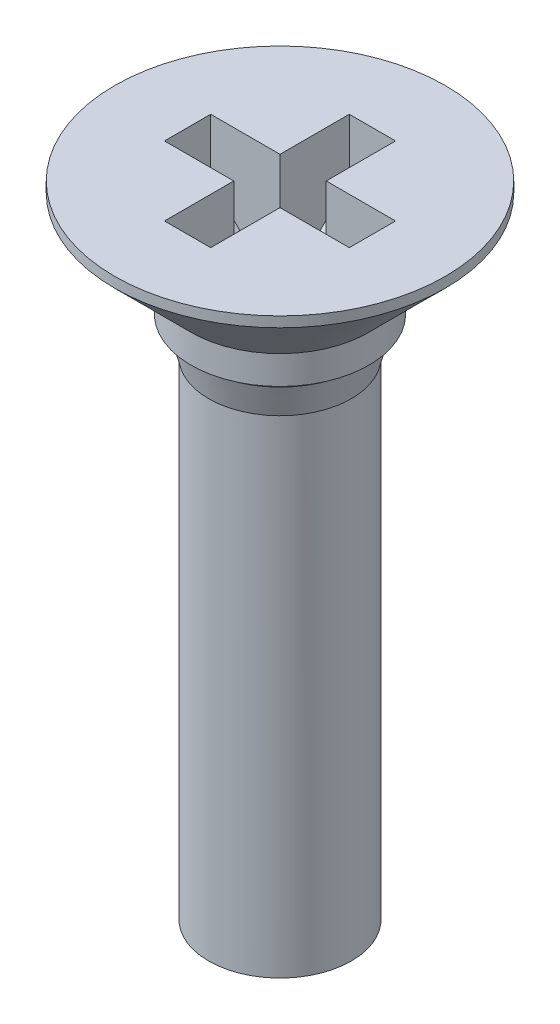
ISO-10303-21;
HEADER;
FILE_DESCRIPTION(('STEP AP214'),'2;1');
FILE_NAME('part.step','',(''),(''),'','','');
FILE_SCHEMA(('AUTOMOTIVE_DESIGN { 1 0 10303 214 1 1 1 1 }'));
ENDSEC;
DATA;
#1=APPLICATION_CONTEXT('core data for automotive mechanical design processes');
#2=APPLICATION_PROTOCOL_DEFINITION('international standard','automotive_design',2000,#1);
#3=PRODUCT_CONTEXT('',#1,'mechanical');
#4=PRODUCT('Part','Part','',(#3));
#5=PRODUCT_RELATED_PRODUCT_CATEGORY('part','',(#4));
#6=PRODUCT_DEFINITION_FORMATION('','',#4);
#7=PRODUCT_DEFINITION_CONTEXT('part definition',#1,'design');
#8=PRODUCT_DEFINITION('design','',#6,#7);
#9=PRODUCT_DEFINITION_SHAPE('','',#8);
#10=(LENGTH_UNIT() NAMED_UNIT(*) SI_UNIT(.MILLI.,.METRE.));
#11=(NAMED_UNIT(*) PLANE_ANGLE_UNIT() SI_UNIT($,.RADIAN.));
#12=(NAMED_UNIT(*) SI_UNIT($,.STERADIAN.) SOLID_ANGLE_UNIT());
#13=UNCERTAINTY_MEASURE_WITH_UNIT(LENGTH_MEASURE(1.E-05),#10,'distance_accuracy_value','');
#14=(GEOMETRIC_REPRESENTATION_CONTEXT(3) GLOBAL_UNCERTAINTY_ASSIGNED_CONTEXT((#13)) GLOBAL_UNIT_ASSIGNED_CONTEXT((#10,
#11,#12)) REPRESENTATION_CONTEXT('',''));
#15=CARTESIAN_POINT('',(0.,0.,0.));
#16=DIRECTION('',(0.,0.,1.));
#17=DIRECTION('',(1.,0.,0.));
#18=AXIS2_PLACEMENT_3D('',#15,#16,#17);
#19=CARTESIAN_POINT('',(0.,-4.2,-0.65));
#20=DIRECTION('',(0.,0.,-1.));
#21=DIRECTION('',(-1.,0.,0.));
#22=AXIS2_PLACEMENT_3D('',#19,#20,#21);
#23=PLANE('',#22);
#24=DIRECTION('',(0.,1.,0.));
#25=VECTOR('',#24,1.);
#26=CARTESIAN_POINT('',(0.65,-4.2,-0.65));
#27=LINE('',#26,#25);
#28=CARTESIAN_POINT('',(0.65,-3.2,-0.65));
#29=VERTEX_POINT('',#28);
#30=CARTESIAN_POINT('',(0.65,0.,-0.65));
#31=VERTEX_POINT('',#30);
#32=EDGE_CURVE('E202',#29,#31,#27,.T.);
#33=ORIENTED_EDGE('',*,*,#32,.F.);
#34=DIRECTION('',(1.,0.,0.));
#35=VECTOR('',#34,1.);
#36=CARTESIAN_POINT('',(-1.,-3.2,-0.65));
#37=LINE('',#36,#35);
#38=CARTESIAN_POINT('',(1.,-3.2,-0.65));
#39=VERTEX_POINT('',#38);
#40=EDGE_CURVE('E237',#29,#39,#37,.T.);
#41=ORIENTED_EDGE('',*,*,#40,.T.);
#42=DIRECTION('',(0.707106781186547,0.707106781186548,0.));
#43=VECTOR('',#42,1.);
#44=CARTESIAN_POINT('',(2.6,-1.6,-0.65));
#45=LINE('',#44,#43);
#46=CARTESIAN_POINT('',(2.6,-1.6,-0.65));
#47=VERTEX_POINT('',#46);
#48=EDGE_CURVE('E241',#39,#47,#45,.T.);
#49=ORIENTED_EDGE('',*,*,#48,.T.);
#50=DIRECTION('',(0.,1.,0.));
#51=VECTOR('',#50,1.);
#52=CARTESIAN_POINT('',(2.6,0.,-0.65));
#53=LINE('',#52,#51);
#54=CARTESIAN_POINT('',(2.6,0.,-0.65));
#55=VERTEX_POINT('',#54);
#56=EDGE_CURVE('E244',#47,#55,#53,.T.);
#57=ORIENTED_EDGE('',*,*,#56,.T.);
#58=DIRECTION('',(-1.,0.,0.));
#59=VECTOR('',#58,1.);
#60=CARTESIAN_POINT('',(2.6,0.,-0.65));
#61=LINE('',#60,#59);
#62=EDGE_CURVE('E248',#55,#31,#61,.T.);
#63=ORIENTED_EDGE('',*,*,#62,.T.);
#64=EDGE_LOOP('',(#33,#41,#49,#57,#63));
#65=FACE_BOUND('',#64,.T.);
#66=ADVANCED_FACE('F37',(#65),#23,.F.);
#67=CARTESIAN_POINT('',(0.,-4.2,0.65));
#68=DIRECTION('',(0.,0.,-1.));
#69=DIRECTION('',(-1.,0.,0.));
#70=AXIS2_PLACEMENT_3D('',#67,#68,#69);
#71=PLANE('',#70);
#72=DIRECTION('',(1.,0.,0.));
#73=VECTOR('',#72,1.);
#74=CARTESIAN_POINT('',(-1.,-3.2,0.65));
#75=LINE('',#74,#73);
#76=CARTESIAN_POINT('',(0.65,-3.2,0.65));
#77=VERTEX_POINT('',#76);
#78=CARTESIAN_POINT('',(1.,-3.2,0.65));
#79=VERTEX_POINT('',#78);
#80=EDGE_CURVE('E219',#77,#79,#75,.T.);
#81=ORIENTED_EDGE('',*,*,#80,.F.);
#82=DIRECTION('',(0.,1.,0.));
#83=VECTOR('',#82,1.);
#84=CARTESIAN_POINT('',(0.65,-4.2,0.65));
#85=LINE('',#84,#83);
#86=CARTESIAN_POINT('',(0.65,0.,0.65));
#87=VERTEX_POINT('',#86);
#88=EDGE_CURVE('E45',#77,#87,#85,.T.);
#89=ORIENTED_EDGE('',*,*,#88,.T.);
#90=DIRECTION('',(-1.,0.,0.));
#91=VECTOR('',#90,1.);
#92=CARTESIAN_POINT('',(2.6,0.,0.65));
#93=LINE('',#92,#91);
#94=CARTESIAN_POINT('',(2.6,0.,0.65));
#95=VERTEX_POINT('',#94);
#96=EDGE_CURVE('E228',#95,#87,#93,.T.);
#97=ORIENTED_EDGE('',*,*,#96,.F.);
#98=DIRECTION('',(0.,1.,0.));
#99=VECTOR('',#98,1.);
#100=CARTESIAN_POINT('',(2.6,0.,0.65));
#101=LINE('',#100,#99);
#102=CARTESIAN_POINT('',(2.6,-1.6,0.65));
#103=VERTEX_POINT('',#102);
#104=EDGE_CURVE('E225',#103,#95,#101,.T.);
#105=ORIENTED_EDGE('',*,*,#104,.F.);
#106=DIRECTION('',(0.707106781186547,0.707106781186548,0.));
#107=VECTOR('',#106,1.);
#108=CARTESIAN_POINT('',(2.6,-1.6,0.65));
#109=LINE('',#108,#107);
#110=EDGE_CURVE('E222',#79,#103,#109,.T.);
#111=ORIENTED_EDGE('',*,*,#110,.F.);
#112=EDGE_LOOP('',(#81,#89,#97,#105,#111));
#113=FACE_BOUND('',#112,.T.);
#114=ADVANCED_FACE('F291',(#113),#71,.T.);
#115=CARTESIAN_POINT('',(0.,0.,0.));
#116=DIRECTION('',(0.,-1.,0.));
#117=DIRECTION('',(1.,0.,0.));
#118=AXIS2_PLACEMENT_3D('',#115,#116,#117);
#119=PLANE('',#118);
#120=DIRECTION('',(1.,0.,0.));
#121=VECTOR('',#120,1.);
#122=CARTESIAN_POINT('',(-0.65,0.,2.6));
#123=LINE('',#122,#121);
#124=CARTESIAN_POINT('',(-0.65,0.,2.6));
#125=VERTEX_POINT('',#124);
#126=CARTESIAN_POINT('',(0.65,0.,2.6));
#127=VERTEX_POINT('',#126);
#128=EDGE_CURVE('E203',#125,#127,#123,.T.);
#129=ORIENTED_EDGE('',*,*,#128,.F.);
#130=DIRECTION('',(0.,0.,1.));
#131=VECTOR('',#130,1.);
#132=CARTESIAN_POINT('',(-0.65,0.,-2.6));
#133=LINE('',#132,#131);
#134=CARTESIAN_POINT('',(-0.65,0.,0.65));
#135=VERTEX_POINT('',#134);
#136=EDGE_CURVE('E196',#135,#125,#133,.T.);
#137=ORIENTED_EDGE('',*,*,#136,.F.);
#138=CARTESIAN_POINT('',(-2.6,0.,0.65));
#139=VERTEX_POINT('',#138);
#140=EDGE_CURVE('E227',#135,#139,#93,.T.);
#141=ORIENTED_EDGE('',*,*,#140,.T.);
#142=DIRECTION('',(0.,0.,1.));
#143=VECTOR('',#142,1.);
#144=CARTESIAN_POINT('',(-2.6,0.,-0.65));
#145=LINE('',#144,#143);
#146=CARTESIAN_POINT('',(-2.6,0.,-0.65));
#147=VERTEX_POINT('',#146);
#148=EDGE_CURVE('E258',#147,#139,#145,.T.);
#149=ORIENTED_EDGE('',*,*,#148,.F.);
#150=CARTESIAN_POINT('',(-0.65,0.,-0.65));
#151=VERTEX_POINT('',#150);
#152=EDGE_CURVE('E247',#151,#147,#61,.T.);
#153=ORIENTED_EDGE('',*,*,#152,.F.);
#154=CARTESIAN_POINT('',(-0.65,0.,-2.6));
#155=VERTEX_POINT('',#154);
#156=EDGE_CURVE('E197',#155,#151,#133,.T.);
#157=ORIENTED_EDGE('',*,*,#156,.F.);
#158=DIRECTION('',(1.,0.,0.));
#159=VECTOR('',#158,1.);
#160=CARTESIAN_POINT('',(-0.65,0.,-2.6));
#161=LINE('',#160,#159);
#162=CARTESIAN_POINT('',(0.65,0.,-2.6));
#163=VERTEX_POINT('',#162);
#164=EDGE_CURVE('E205',#155,#163,#161,.T.);
#165=ORIENTED_EDGE('',*,*,#164,.T.);
#166=DIRECTION('',(0.,0.,1.));
#167=VECTOR('',#166,1.);
#168=CARTESIAN_POINT('',(0.65,0.,-2.6));
#169=LINE('',#168,#167);
#170=EDGE_CURVE('E181',#163,#31,#169,.T.);
#171=ORIENTED_EDGE('',*,*,#170,.T.);
#172=ORIENTED_EDGE('',*,*,#62,.F.);
#173=DIRECTION('',(0.,0.,1.));
#174=VECTOR('',#173,1.);
#175=CARTESIAN_POINT('',(2.6,0.,-0.65));
#176=LINE('',#175,#174);
#177=EDGE_CURVE('E261',#55,#95,#176,.T.);
#178=ORIENTED_EDGE('',*,*,#177,.T.);
#179=ORIENTED_EDGE('',*,*,#96,.T.);
#180=EDGE_CURVE('E60',#87,#127,#169,.T.);
#181=ORIENTED_EDGE('',*,*,#180,.T.);
#182=EDGE_LOOP('',(#129,#137,#141,#149,#153,#157,#165,#171,#172,#178,#179,#181));
#183=FACE_BOUND('',#182,.T.);
#184=CARTESIAN_POINT('',(0.,0.,0.));
#185=DIRECTION('',(0.,1.,0.));
#186=DIRECTION('',(-1.,0.,0.));
#187=AXIS2_PLACEMENT_3D('',#184,#185,#186);
#188=CIRCLE('',#187,4.65);
#189=CARTESIAN_POINT('',(-4.65,0.,0.));
#190=VERTEX_POINT('',#189);
#191=EDGE_CURVE('E287',#190,#190,#188,.T.);
#192=ORIENTED_EDGE('',*,*,#191,.T.);
#193=EDGE_LOOP('',(#192));
#194=FACE_BOUND('',#193,.T.);
#195=ADVANCED_FACE('F39',(#183,#194),#119,.F.);
#196=CARTESIAN_POINT('',(0.,0.,0.));
#197=DIRECTION('',(0.,1.,0.));
#198=DIRECTION('',(-1.,0.,0.));
#199=AXIS2_PLACEMENT_3D('',#196,#197,#198);
#200=CYLINDRICAL_SURFACE('',#199,4.65);
#201=ORIENTED_EDGE('',*,*,#191,.F.);
#202=EDGE_LOOP('',(#201));
#203=FACE_BOUND('',#202,.T.);
#204=CARTESIAN_POINT('',(0.,-0.290000000000009,0.));
#205=DIRECTION('',(0.,1.,0.));
#206=DIRECTION('',(-1.,0.,0.));
#207=AXIS2_PLACEMENT_3D('',#204,#205,#206);
#208=CIRCLE('',#207,4.65);
#209=CARTESIAN_POINT('',(-4.65,-0.290000000000009,0.));
#210=VERTEX_POINT('',#209);
#211=EDGE_CURVE('E284',#210,#210,#208,.T.);
#212=ORIENTED_EDGE('',*,*,#211,.T.);
#213=EDGE_LOOP('',(#212));
#214=FACE_BOUND('',#213,.T.);
#215=ADVANCED_FACE('F396',(#203,#214),#200,.T.);
#216=CARTESIAN_POINT('',(0.,-2.44,0.));
#217=DIRECTION('',(0.,1.,0.));
#218=DIRECTION('',(-1.,0.,0.));
#219=AXIS2_PLACEMENT_3D('',#216,#217,#218);
#220=CONICAL_SURFACE('',#219,2.5,0.78539816339745);
#221=ORIENTED_EDGE('',*,*,#211,.F.);
#222=EDGE_LOOP('',(#221));
#223=FACE_BOUND('',#222,.T.);
#224=CARTESIAN_POINT('',(0.,-2.44,0.));
#225=DIRECTION('',(0.,1.,0.));
#226=DIRECTION('',(-1.,0.,0.));
#227=AXIS2_PLACEMENT_3D('',#224,#225,#226);
#228=CIRCLE('',#227,2.5);
#229=CARTESIAN_POINT('',(-2.5,-2.44,0.));
#230=VERTEX_POINT('',#229);
#231=EDGE_CURVE('E281',#230,#230,#228,.T.);
#232=ORIENTED_EDGE('',*,*,#231,.T.);
#233=EDGE_LOOP('',(#232));
#234=FACE_BOUND('',#233,.T.);
#235=ADVANCED_FACE('F393',(#223,#234),#220,.T.);
#236=CARTESIAN_POINT('',(0.,0.,0.));
#237=DIRECTION('',(0.,1.,0.));
#238=DIRECTION('',(-1.,0.,0.));
#239=AXIS2_PLACEMENT_3D('',#236,#237,#238);
#240=CYLINDRICAL_SURFACE('',#239,2.5);
#241=ORIENTED_EDGE('',*,*,#231,.F.);
#242=EDGE_LOOP('',(#241));
#243=FACE_BOUND('',#242,.T.);
#244=CARTESIAN_POINT('',(0.,-3.24,0.));
#245=DIRECTION('',(0.,1.,0.));
#246=DIRECTION('',(-1.,0.,0.));
#247=AXIS2_PLACEMENT_3D('',#244,#245,#246);
#248=CIRCLE('',#247,2.5);
#249=CARTESIAN_POINT('',(-2.5,-3.24,0.));
#250=VERTEX_POINT('',#249);
#251=EDGE_CURVE('E278',#250,#250,#248,.T.);
#252=ORIENTED_EDGE('',*,*,#251,.T.);
#253=EDGE_LOOP('',(#252));
#254=FACE_BOUND('',#253,.T.);
#255=ADVANCED_FACE('F389',(#243,#254),#240,.T.);
#256=CARTESIAN_POINT('',(2.5,-3.24,0.));
#257=DIRECTION('',(0.,1.,0.));
#258=DIRECTION('',(-1.,0.,0.));
#259=AXIS2_PLACEMENT_3D('',#256,#257,#258);
#260=PLANE('',#259);
#261=ORIENTED_EDGE('',*,*,#251,.F.);
#262=EDGE_LOOP('',(#261));
#263=FACE_BOUND('',#262,.T.);
#264=CARTESIAN_POINT('',(0.,-3.24,0.));
#265=DIRECTION('',(0.,1.,0.));
#266=DIRECTION('',(-1.,0.,0.));
#267=AXIS2_PLACEMENT_3D('',#264,#265,#266);
#268=CIRCLE('',#267,2.24);
#269=CARTESIAN_POINT('',(-2.24,-3.24,0.));
#270=VERTEX_POINT('',#269);
#271=EDGE_CURVE('E275',#270,#270,#268,.T.);
#272=ORIENTED_EDGE('',*,*,#271,.T.);
#273=EDGE_LOOP('',(#272));
#274=FACE_BOUND('',#273,.T.);
#275=ADVANCED_FACE('F385',(#263,#274),#260,.F.);
#276=CARTESIAN_POINT('',(0.,0.,0.));
#277=DIRECTION('',(0.,1.,0.));
#278=DIRECTION('',(-1.,0.,0.));
#279=AXIS2_PLACEMENT_3D('',#276,#277,#278);
#280=CYLINDRICAL_SURFACE('',#279,2.24);
#281=ORIENTED_EDGE('',*,*,#271,.F.);
#282=EDGE_LOOP('',(#281));
#283=FACE_BOUND('',#282,.T.);
#284=CARTESIAN_POINT('',(0.,-3.43976228885538,0.));
#285=DIRECTION('',(0.,1.,0.));
#286=DIRECTION('',(-1.,0.,0.));
#287=AXIS2_PLACEMENT_3D('',#284,#285,#286);
#288=CIRCLE('',#287,2.24);
#289=CARTESIAN_POINT('',(-2.24,-3.43976228885538,0.));
#290=VERTEX_POINT('',#289);
#291=EDGE_CURVE('E272',#290,#290,#288,.T.);
#292=ORIENTED_EDGE('',*,*,#291,.T.);
#293=EDGE_LOOP('',(#292));
#294=FACE_BOUND('',#293,.T.);
#295=ADVANCED_FACE('F381',(#283,#294),#280,.T.);
#296=CARTESIAN_POINT('',(0.,-4.3,0.));
#297=DIRECTION('',(0.,1.,0.));
#298=DIRECTION('',(-1.,0.,0.));
#299=AXIS2_PLACEMENT_3D('',#296,#297,#298);
#300=CONICAL_SURFACE('',#299,2.0095,0.26179938779915);
#301=ORIENTED_EDGE('',*,*,#291,.F.);
#302=EDGE_LOOP('',(#301));
#303=FACE_BOUND('',#302,.T.);
#304=CARTESIAN_POINT('',(0.,-4.3,0.));
#305=DIRECTION('',(0.,1.,0.));
#306=DIRECTION('',(-1.,0.,0.));
#307=AXIS2_PLACEMENT_3D('',#304,#305,#306);
#308=CIRCLE('',#307,2.0095);
#309=CARTESIAN_POINT('',(-2.0095,-4.3,0.));
#310=VERTEX_POINT('',#309);
#311=EDGE_CURVE('E257',#310,#310,#308,.T.);
#312=ORIENTED_EDGE('',*,*,#311,.T.);
#313=EDGE_LOOP('',(#312));
#314=FACE_BOUND('',#313,.T.);
#315=ADVANCED_FACE('F377',(#303,#314),#300,.T.);
#316=CARTESIAN_POINT('',(0.,0.,0.));
#317=DIRECTION('',(0.,1.,0.));
#318=DIRECTION('',(-1.,0.,0.));
#319=AXIS2_PLACEMENT_3D('',#316,#317,#318);
#320=CYLINDRICAL_SURFACE('',#319,2.0095);
#321=ORIENTED_EDGE('',*,*,#311,.F.);
#322=EDGE_LOOP('',(#321));
#323=FACE_BOUND('',#322,.T.);
#324=CARTESIAN_POINT('',(0.,-18.,0.));
#325=DIRECTION('',(0.,-1.,0.));
#326=DIRECTION('',(1.,0.,0.));
#327=AXIS2_PLACEMENT_3D('',#324,#325,#326);
#328=CIRCLE('',#327,2.0095);
#329=CARTESIAN_POINT('',(2.0095,-18.,0.));
#330=VERTEX_POINT('',#329);
#331=EDGE_CURVE('E172',#330,#330,#328,.T.);
#332=ORIENTED_EDGE('',*,*,#331,.F.);
#333=EDGE_LOOP('',(#332));
#334=FACE_BOUND('',#333,.T.);
#335=ADVANCED_FACE('F374',(#323,#334),#320,.T.);
#336=CARTESIAN_POINT('',(-2.6,-1.6,-0.65));
#337=DIRECTION('',(-0.707106781186548,-0.707106781186547,0.));
#338=DIRECTION('',(0.707106781186547,-0.707106781186548,0.));
#339=AXIS2_PLACEMENT_3D('',#336,#337,#338);
#340=PLANE('',#339);
#341=DIRECTION('',(0.,0.,1.));
#342=VECTOR('',#341,1.);
#343=CARTESIAN_POINT('',(-1.,-3.2,-0.65));
#344=LINE('',#343,#342);
#345=CARTESIAN_POINT('',(-1.,-3.2,-0.65));
#346=VERTEX_POINT('',#345);
#347=CARTESIAN_POINT('',(-1.,-3.2,0.65));
#348=VERTEX_POINT('',#347);
#349=EDGE_CURVE('E254',#346,#348,#344,.T.);
#350=ORIENTED_EDGE('',*,*,#349,.F.);
#351=DIRECTION('',(0.707106781186547,-0.707106781186548,0.));
#352=VECTOR('',#351,1.);
#353=CARTESIAN_POINT('',(-2.6,-1.6,-0.65));
#354=LINE('',#353,#352);
#355=CARTESIAN_POINT('',(-2.6,-1.6,-0.65));
#356=VERTEX_POINT('',#355);
#357=EDGE_CURVE('E234',#356,#346,#354,.T.);
#358=ORIENTED_EDGE('',*,*,#357,.F.);
#359=DIRECTION('',(0.,0.,1.));
#360=VECTOR('',#359,1.);
#361=CARTESIAN_POINT('',(-2.6,-1.6,-0.65));
#362=LINE('',#361,#360);
#363=CARTESIAN_POINT('',(-2.6,-1.6,0.65));
#364=VERTEX_POINT('',#363);
#365=EDGE_CURVE('E255',#356,#364,#362,.T.);
#366=ORIENTED_EDGE('',*,*,#365,.T.);
#367=DIRECTION('',(0.707106781186547,-0.707106781186548,0.));
#368=VECTOR('',#367,1.);
#369=CARTESIAN_POINT('',(-2.6,-1.6,0.65));
#370=LINE('',#369,#368);
#371=EDGE_CURVE('E216',#364,#348,#370,.T.);
#372=ORIENTED_EDGE('',*,*,#371,.T.);
#373=EDGE_LOOP('',(#350,#358,#366,#372));
#374=FACE_BOUND('',#373,.T.);
#375=ADVANCED_FACE('F328',(#374),#340,.F.);
#376=CARTESIAN_POINT('',(-2.6,0.,-0.65));
#377=DIRECTION('',(-1.,0.,0.));
#378=DIRECTION('',(0.,0.,1.));
#379=AXIS2_PLACEMENT_3D('',#376,#377,#378);
#380=PLANE('',#379);
#381=ORIENTED_EDGE('',*,*,#365,.F.);
#382=DIRECTION('',(0.,-1.,0.));
#383=VECTOR('',#382,1.);
#384=CARTESIAN_POINT('',(-2.6,0.,-0.65));
#385=LINE('',#384,#383);
#386=EDGE_CURVE('E251',#147,#356,#385,.T.);
#387=ORIENTED_EDGE('',*,*,#386,.F.);
#388=ORIENTED_EDGE('',*,*,#148,.T.);
#389=DIRECTION('',(0.,-1.,0.));
#390=VECTOR('',#389,1.);
#391=CARTESIAN_POINT('',(-2.6,0.,0.65));
#392=LINE('',#391,#390);
#393=EDGE_CURVE('E231',#139,#364,#392,.T.);
#394=ORIENTED_EDGE('',*,*,#393,.T.);
#395=EDGE_LOOP('',(#381,#387,#388,#394));
#396=FACE_BOUND('',#395,.T.);
#397=ADVANCED_FACE('F373',(#396),#380,.F.);
#398=CARTESIAN_POINT('',(2.6,0.,-0.65));
#399=DIRECTION('',(1.,0.,0.));
#400=DIRECTION('',(0.,0.,-1.));
#401=AXIS2_PLACEMENT_3D('',#398,#399,#400);
#402=PLANE('',#401);
#403=ORIENTED_EDGE('',*,*,#177,.F.);
#404=ORIENTED_EDGE('',*,*,#56,.F.);
#405=DIRECTION('',(0.,0.,1.));
#406=VECTOR('',#405,1.);
#407=CARTESIAN_POINT('',(2.6,-1.6,-0.65));
#408=LINE('',#407,#406);
#409=EDGE_CURVE('E264',#47,#103,#408,.T.);
#410=ORIENTED_EDGE('',*,*,#409,.T.);
#411=ORIENTED_EDGE('',*,*,#104,.T.);
#412=EDGE_LOOP('',(#403,#404,#410,#411));
#413=FACE_BOUND('',#412,.T.);
#414=ADVANCED_FACE('F300',(#413),#402,.F.);
#415=CARTESIAN_POINT('',(2.6,-1.6,-0.65));
#416=DIRECTION('',(0.707106781186548,-0.707106781186547,0.));
#417=DIRECTION('',(0.707106781186547,0.707106781186548,0.));
#418=AXIS2_PLACEMENT_3D('',#415,#416,#417);
#419=PLANE('',#418);
#420=ORIENTED_EDGE('',*,*,#409,.F.);
#421=ORIENTED_EDGE('',*,*,#48,.F.);
#422=DIRECTION('',(0.,0.,1.));
#423=VECTOR('',#422,1.);
#424=CARTESIAN_POINT('',(1.,-3.2,-0.65));
#425=LINE('',#424,#423);
#426=EDGE_CURVE('E266',#39,#79,#425,.T.);
#427=ORIENTED_EDGE('',*,*,#426,.T.);
#428=ORIENTED_EDGE('',*,*,#110,.T.);
#429=EDGE_LOOP('',(#420,#421,#427,#428));
#430=FACE_BOUND('',#429,.T.);
#431=ADVANCED_FACE('F306',(#430),#419,.F.);
#432=CARTESIAN_POINT('',(-1.,-3.2,-0.65));
#433=DIRECTION('',(0.,-1.,0.));
#434=DIRECTION('',(0.,0.,-1.));
#435=AXIS2_PLACEMENT_3D('',#432,#433,#434);
#436=PLANE('',#435);
#437=CARTESIAN_POINT('',(-0.65,-3.2,0.65));
#438=VERTEX_POINT('',#437);
#439=EDGE_CURVE('E220',#348,#438,#75,.T.);
#440=ORIENTED_EDGE('',*,*,#439,.T.);
#441=DIRECTION('',(0.,0.,-1.));
#442=VECTOR('',#441,1.);
#443=CARTESIAN_POINT('',(-0.65,-3.2,1.));
#444=LINE('',#443,#442);
#445=CARTESIAN_POINT('',(-0.65,-3.2,1.));
#446=VERTEX_POINT('',#445);
#447=EDGE_CURVE('E156',#446,#438,#444,.T.);
#448=ORIENTED_EDGE('',*,*,#447,.F.);
#449=DIRECTION('',(1.,0.,0.));
#450=VECTOR('',#449,1.);
#451=CARTESIAN_POINT('',(-0.65,-3.2,1.));
#452=LINE('',#451,#450);
#453=CARTESIAN_POINT('',(0.65,-3.2,1.));
#454=VERTEX_POINT('',#453);
#455=EDGE_CURVE('E150',#446,#454,#452,.T.);
#456=ORIENTED_EDGE('',*,*,#455,.T.);
#457=DIRECTION('',(0.,0.,-1.));
#458=VECTOR('',#457,1.);
#459=CARTESIAN_POINT('',(0.65,-3.2,1.));
#460=LINE('',#459,#458);
#461=EDGE_CURVE('E154',#454,#77,#460,.T.);
#462=ORIENTED_EDGE('',*,*,#461,.T.);
#463=ORIENTED_EDGE('',*,*,#80,.T.);
#464=ORIENTED_EDGE('',*,*,#426,.F.);
#465=ORIENTED_EDGE('',*,*,#40,.F.);
#466=CARTESIAN_POINT('',(0.65,-3.2,-1.));
#467=VERTEX_POINT('',#466);
#468=EDGE_CURVE('E52',#29,#467,#460,.T.);
#469=ORIENTED_EDGE('',*,*,#468,.T.);
#470=DIRECTION('',(1.,0.,0.));
#471=VECTOR('',#470,1.);
#472=CARTESIAN_POINT('',(-0.65,-3.2,-1.));
#473=LINE('',#472,#471);
#474=CARTESIAN_POINT('',(-0.65,-3.2,-1.));
#475=VERTEX_POINT('',#474);
#476=EDGE_CURVE('E161',#475,#467,#473,.T.);
#477=ORIENTED_EDGE('',*,*,#476,.F.);
#478=CARTESIAN_POINT('',(-0.65,-3.2,-0.65));
#479=VERTEX_POINT('',#478);
#480=EDGE_CURVE('E188',#479,#475,#444,.T.);
#481=ORIENTED_EDGE('',*,*,#480,.F.);
#482=EDGE_CURVE('E238',#346,#479,#37,.T.);
#483=ORIENTED_EDGE('',*,*,#482,.F.);
#484=ORIENTED_EDGE('',*,*,#349,.T.);
#485=EDGE_LOOP('',(#440,#448,#456,#462,#463,#464,#465,#469,#477,#481,#483,#484));
#486=FACE_BOUND('',#485,.T.);
#487=ADVANCED_FACE('F153',(#486),#436,.F.);
#488=ORIENTED_EDGE('',*,*,#482,.T.);
#489=DIRECTION('',(0.,1.,0.));
#490=VECTOR('',#489,1.);
#491=CARTESIAN_POINT('',(-0.65,-4.2,-0.65));
#492=LINE('',#491,#490);
#493=EDGE_CURVE('E213',#479,#151,#492,.T.);
#494=ORIENTED_EDGE('',*,*,#493,.T.);
#495=ORIENTED_EDGE('',*,*,#152,.T.);
#496=ORIENTED_EDGE('',*,*,#386,.T.);
#497=ORIENTED_EDGE('',*,*,#357,.T.);
#498=EDGE_LOOP('',(#488,#494,#495,#496,#497));
#499=FACE_BOUND('',#498,.T.);
#500=ADVANCED_FACE('F323',(#499),#23,.F.);
#501=DIRECTION('',(0.,1.,0.));
#502=VECTOR('',#501,1.);
#503=CARTESIAN_POINT('',(-0.65,-4.2,0.65));
#504=LINE('',#503,#502);
#505=EDGE_CURVE('E11',#438,#135,#504,.T.);
#506=ORIENTED_EDGE('',*,*,#505,.F.);
#507=ORIENTED_EDGE('',*,*,#439,.F.);
#508=ORIENTED_EDGE('',*,*,#371,.F.);
#509=ORIENTED_EDGE('',*,*,#393,.F.);
#510=ORIENTED_EDGE('',*,*,#140,.F.);
#511=EDGE_LOOP('',(#506,#507,#508,#509,#510));
#512=FACE_BOUND('',#511,.T.);
#513=ADVANCED_FACE('F333',(#512),#71,.T.);
#514=CARTESIAN_POINT('',(-0.65,-1.6,2.6));
#515=DIRECTION('',(0.,-0.707106781186547,0.707106781186548));
#516=DIRECTION('',(0.,-0.707106781186548,-0.707106781186547));
#517=AXIS2_PLACEMENT_3D('',#514,#515,#516);
#518=PLANE('',#517);
#519=ORIENTED_EDGE('',*,*,#455,.F.);
#520=DIRECTION('',(0.,-0.707106781186548,-0.707106781186547));
#521=VECTOR('',#520,1.);
#522=CARTESIAN_POINT('',(-0.65,-1.6,2.6));
#523=LINE('',#522,#521);
#524=CARTESIAN_POINT('',(-0.65,-1.6,2.6));
#525=VERTEX_POINT('',#524);
#526=EDGE_CURVE('E186',#525,#446,#523,.T.);
#527=ORIENTED_EDGE('',*,*,#526,.F.);
#528=DIRECTION('',(1.,0.,0.));
#529=VECTOR('',#528,1.);
#530=CARTESIAN_POINT('',(-0.65,-1.6,2.6));
#531=LINE('',#530,#529);
#532=CARTESIAN_POINT('',(0.65,-1.6,2.6));
#533=VERTEX_POINT('',#532);
#534=EDGE_CURVE('E170',#525,#533,#531,.T.);
#535=ORIENTED_EDGE('',*,*,#534,.T.);
#536=DIRECTION('',(0.,-0.707106781186548,-0.707106781186547));
#537=VECTOR('',#536,1.);
#538=CARTESIAN_POINT('',(0.65,-1.6,2.6));
#539=LINE('',#538,#537);
#540=EDGE_CURVE('E166',#533,#454,#539,.T.);
#541=ORIENTED_EDGE('',*,*,#540,.T.);
#542=EDGE_LOOP('',(#519,#527,#535,#541));
#543=FACE_BOUND('',#542,.T.);
#544=ADVANCED_FACE('F169',(#543),#518,.F.);
#545=CARTESIAN_POINT('',(-0.65,-4.2,0.));
#546=DIRECTION('',(-1.,0.,0.));
#547=DIRECTION('',(0.,0.,1.));
#548=AXIS2_PLACEMENT_3D('',#545,#546,#547);
#549=PLANE('',#548);
#550=ORIENTED_EDGE('',*,*,#505,.T.);
#551=ORIENTED_EDGE('',*,*,#136,.T.);
#552=DIRECTION('',(0.,-1.,0.));
#553=VECTOR('',#552,1.);
#554=CARTESIAN_POINT('',(-0.65,0.,2.6));
#555=LINE('',#554,#553);
#556=EDGE_CURVE('E162',#125,#525,#555,.T.);
#557=ORIENTED_EDGE('',*,*,#556,.T.);
#558=ORIENTED_EDGE('',*,*,#526,.T.);
#559=ORIENTED_EDGE('',*,*,#447,.T.);
#560=EDGE_LOOP('',(#550,#551,#557,#558,#559));
#561=FACE_BOUND('',#560,.T.);
#562=ADVANCED_FACE('F338',(#561),#549,.F.);
#563=CARTESIAN_POINT('',(0.65,-4.2,0.));
#564=DIRECTION('',(-1.,0.,0.));
#565=DIRECTION('',(0.,0.,1.));
#566=AXIS2_PLACEMENT_3D('',#563,#564,#565);
#567=PLANE('',#566);
#568=ORIENTED_EDGE('',*,*,#461,.F.);
#569=ORIENTED_EDGE('',*,*,#540,.F.);
#570=DIRECTION('',(0.,-1.,0.));
#571=VECTOR('',#570,1.);
#572=CARTESIAN_POINT('',(0.65,0.,2.6));
#573=LINE('',#572,#571);
#574=EDGE_CURVE('E184',#127,#533,#573,.T.);
#575=ORIENTED_EDGE('',*,*,#574,.F.);
#576=ORIENTED_EDGE('',*,*,#180,.F.);
#577=ORIENTED_EDGE('',*,*,#88,.F.);
#578=EDGE_LOOP('',(#568,#569,#575,#576,#577));
#579=FACE_BOUND('',#578,.T.);
#580=ADVANCED_FACE('F165',(#579),#567,.T.);
#581=CARTESIAN_POINT('',(-0.65,0.,2.6));
#582=DIRECTION('',(0.,0.,1.));
#583=DIRECTION('',(1.,0.,0.));
#584=AXIS2_PLACEMENT_3D('',#581,#582,#583);
#585=PLANE('',#584);
#586=ORIENTED_EDGE('',*,*,#534,.F.);
#587=ORIENTED_EDGE('',*,*,#556,.F.);
#588=ORIENTED_EDGE('',*,*,#128,.T.);
#589=ORIENTED_EDGE('',*,*,#574,.T.);
#590=EDGE_LOOP('',(#586,#587,#588,#589));
#591=FACE_BOUND('',#590,.T.);
#592=ADVANCED_FACE('F342',(#591),#585,.F.);
#593=ORIENTED_EDGE('',*,*,#480,.T.);
#594=DIRECTION('',(0.,0.707106781186548,-0.707106781186547));
#595=VECTOR('',#594,1.);
#596=CARTESIAN_POINT('',(-0.65,-1.6,-2.6));
#597=LINE('',#596,#595);
#598=CARTESIAN_POINT('',(-0.65,-1.6,-2.6));
#599=VERTEX_POINT('',#598);
#600=EDGE_CURVE('E190',#475,#599,#597,.T.);
#601=ORIENTED_EDGE('',*,*,#600,.T.);
#602=DIRECTION('',(0.,1.,0.));
#603=VECTOR('',#602,1.);
#604=CARTESIAN_POINT('',(-0.65,0.,-2.6));
#605=LINE('',#604,#603);
#606=EDGE_CURVE('E193',#599,#155,#605,.T.);
#607=ORIENTED_EDGE('',*,*,#606,.T.);
#608=ORIENTED_EDGE('',*,*,#156,.T.);
#609=ORIENTED_EDGE('',*,*,#493,.F.);
#610=EDGE_LOOP('',(#593,#601,#607,#608,#609));
#611=FACE_BOUND('',#610,.T.);
#612=ADVANCED_FACE('F320',(#611),#549,.F.);
#613=ORIENTED_EDGE('',*,*,#32,.T.);
#614=ORIENTED_EDGE('',*,*,#170,.F.);
#615=DIRECTION('',(0.,1.,0.));
#616=VECTOR('',#615,1.);
#617=CARTESIAN_POINT('',(0.65,0.,-2.6));
#618=LINE('',#617,#616);
#619=CARTESIAN_POINT('',(0.65,-1.6,-2.6));
#620=VERTEX_POINT('',#619);
#621=EDGE_CURVE('E179',#620,#163,#618,.T.);
#622=ORIENTED_EDGE('',*,*,#621,.F.);
#623=DIRECTION('',(0.,0.707106781186548,-0.707106781186547));
#624=VECTOR('',#623,1.);
#625=CARTESIAN_POINT('',(0.65,-1.6,-2.6));
#626=LINE('',#625,#624);
#627=EDGE_CURVE('E167',#467,#620,#626,.T.);
#628=ORIENTED_EDGE('',*,*,#627,.F.);
#629=ORIENTED_EDGE('',*,*,#468,.F.);
#630=EDGE_LOOP('',(#613,#614,#622,#628,#629));
#631=FACE_BOUND('',#630,.T.);
#632=ADVANCED_FACE('F313',(#631),#567,.T.);
#633=CARTESIAN_POINT('',(-0.65,0.,-2.6));
#634=DIRECTION('',(0.,0.,-1.));
#635=DIRECTION('',(-1.,0.,0.));
#636=AXIS2_PLACEMENT_3D('',#633,#634,#635);
#637=PLANE('',#636);
#638=ORIENTED_EDGE('',*,*,#164,.F.);
#639=ORIENTED_EDGE('',*,*,#606,.F.);
#640=DIRECTION('',(1.,0.,0.));
#641=VECTOR('',#640,1.);
#642=CARTESIAN_POINT('',(-0.65,-1.6,-2.6));
#643=LINE('',#642,#641);
#644=EDGE_CURVE('E208',#599,#620,#643,.T.);
#645=ORIENTED_EDGE('',*,*,#644,.T.);
#646=ORIENTED_EDGE('',*,*,#621,.T.);
#647=EDGE_LOOP('',(#638,#639,#645,#646));
#648=FACE_BOUND('',#647,.T.);
#649=ADVANCED_FACE('F316',(#648),#637,.F.);
#650=CARTESIAN_POINT('',(-0.65,-1.6,-2.6));
#651=DIRECTION('',(0.,-0.707106781186547,-0.707106781186548));
#652=DIRECTION('',(0.,0.707106781186548,-0.707106781186547));
#653=AXIS2_PLACEMENT_3D('',#650,#651,#652);
#654=PLANE('',#653);
#655=ORIENTED_EDGE('',*,*,#644,.F.);
#656=ORIENTED_EDGE('',*,*,#600,.F.);
#657=ORIENTED_EDGE('',*,*,#476,.T.);
#658=ORIENTED_EDGE('',*,*,#627,.T.);
#659=EDGE_LOOP('',(#655,#656,#657,#658));
#660=FACE_BOUND('',#659,.T.);
#661=ADVANCED_FACE('F311',(#660),#654,.F.);
#662=CARTESIAN_POINT('',(0.,-18.,0.));
#663=DIRECTION('',(0.,-1.,0.));
#664=DIRECTION('',(1.,0.,0.));
#665=AXIS2_PLACEMENT_3D('',#662,#663,#664);
#666=PLANE('',#665);
#667=ORIENTED_EDGE('',*,*,#331,.T.);
#668=EDGE_LOOP('',(#667));
#669=FACE_BOUND('',#668,.T.);
#670=ADVANCED_FACE('F419',(#669),#666,.T.);
#671=CLOSED_SHELL('',(#66,#114,#195,#215,#235,#255,#275,#295,#315,#335,#375,#397,#414,#431,#487,
#500,#513,#544,#562,#580,#592,#612,#632,#649,#661,#670));
#672=MANIFOLD_SOLID_BREP('B2',#671);
#673=ADVANCED_BREP_SHAPE_REPRESENTATION('',(#18,#672),#14);
#674=SHAPE_DEFINITION_REPRESENTATION(#9,#673);
ENDSEC;
END-ISO-10303-21;
